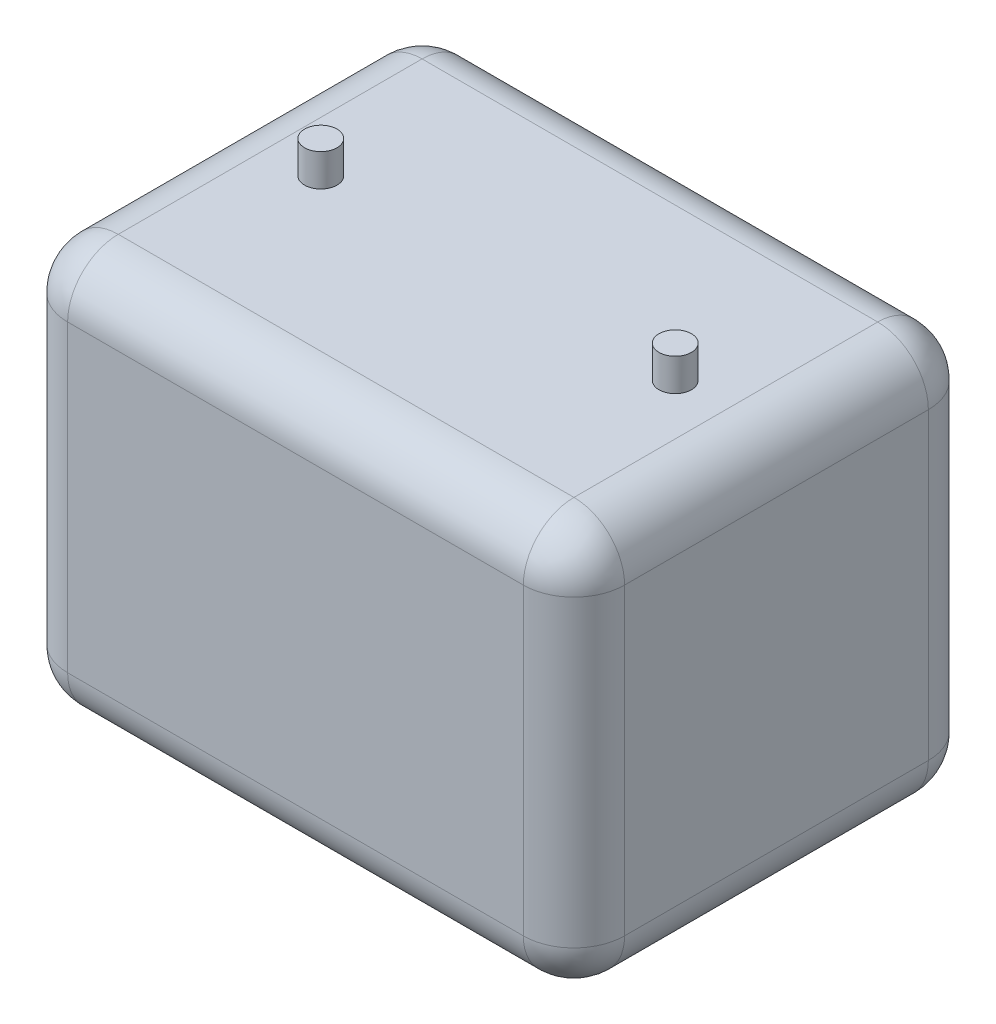
ISO-10303-21;
HEADER;
FILE_DESCRIPTION(('STEP AP214'),'2;1');
FILE_NAME('part.step','',(''),(''),'','','');
FILE_SCHEMA(('AUTOMOTIVE_DESIGN { 1 0 10303 214 1 1 1 1 }'));
ENDSEC;
DATA;
#1=APPLICATION_CONTEXT('core data for automotive mechanical design processes');
#2=APPLICATION_PROTOCOL_DEFINITION('international standard','automotive_design',2000,#1);
#3=PRODUCT_CONTEXT('',#1,'mechanical');
#4=PRODUCT('Part','Part','',(#3));
#5=PRODUCT_RELATED_PRODUCT_CATEGORY('part','',(#4));
#6=PRODUCT_DEFINITION_FORMATION('','',#4);
#7=PRODUCT_DEFINITION_CONTEXT('part definition',#1,'design');
#8=PRODUCT_DEFINITION('design','',#6,#7);
#9=PRODUCT_DEFINITION_SHAPE('','',#8);
#10=(LENGTH_UNIT() NAMED_UNIT(*) SI_UNIT(.MILLI.,.METRE.));
#11=(NAMED_UNIT(*) PLANE_ANGLE_UNIT() SI_UNIT($,.RADIAN.));
#12=(NAMED_UNIT(*) SI_UNIT($,.STERADIAN.) SOLID_ANGLE_UNIT());
#13=UNCERTAINTY_MEASURE_WITH_UNIT(LENGTH_MEASURE(1.E-05),#10,'distance_accuracy_value','');
#14=(GEOMETRIC_REPRESENTATION_CONTEXT(3) GLOBAL_UNCERTAINTY_ASSIGNED_CONTEXT((#13)) GLOBAL_UNIT_ASSIGNED_CONTEXT((#10,
#11,#12)) REPRESENTATION_CONTEXT('',''));
#15=CARTESIAN_POINT('',(0.,0.,0.));
#16=DIRECTION('',(0.,0.,1.));
#17=DIRECTION('',(1.,0.,0.));
#18=AXIS2_PLACEMENT_3D('',#15,#16,#17);
#19=CARTESIAN_POINT('',(27.5,20.,40.));
#20=DIRECTION('',(-1.,0.,0.));
#21=DIRECTION('',(0.,0.,1.));
#22=AXIS2_PLACEMENT_3D('',#19,#20,#21);
#23=PLANE('',#22);
#24=DIRECTION('',(0.,0.,-1.));
#25=VECTOR('',#24,1.);
#26=CARTESIAN_POINT('',(27.5,-15.,40.));
#27=LINE('',#26,#25);
#28=CARTESIAN_POINT('',(27.5,-15.,35.));
#29=VERTEX_POINT('',#28);
#30=CARTESIAN_POINT('',(27.5,-15.,5.));
#31=VERTEX_POINT('',#30);
#32=EDGE_CURVE('E144',#29,#31,#27,.T.);
#33=ORIENTED_EDGE('',*,*,#32,.T.);
#34=DIRECTION('',(0.,1.,0.));
#35=VECTOR('',#34,1.);
#36=CARTESIAN_POINT('',(27.5,20.,5.));
#37=LINE('',#36,#35);
#38=CARTESIAN_POINT('',(27.5,15.,5.));
#39=VERTEX_POINT('',#38);
#40=EDGE_CURVE('E138',#31,#39,#37,.T.);
#41=ORIENTED_EDGE('',*,*,#40,.T.);
#42=DIRECTION('',(0.,0.,-1.));
#43=VECTOR('',#42,1.);
#44=CARTESIAN_POINT('',(27.5,15.,40.));
#45=LINE('',#44,#43);
#46=CARTESIAN_POINT('',(27.5,15.,35.));
#47=VERTEX_POINT('',#46);
#48=EDGE_CURVE('E131',#39,#47,#45,.F.);
#49=ORIENTED_EDGE('',*,*,#48,.T.);
#50=DIRECTION('',(0.,1.,0.));
#51=VECTOR('',#50,1.);
#52=CARTESIAN_POINT('',(27.5,-15.,35.));
#53=LINE('',#52,#51);
#54=EDGE_CURVE('E135',#47,#29,#53,.F.);
#55=ORIENTED_EDGE('',*,*,#54,.T.);
#56=EDGE_LOOP('',(#33,#41,#49,#55));
#57=FACE_BOUND('',#56,.T.);
#58=ADVANCED_FACE('F41',(#57),#23,.F.);
#59=CARTESIAN_POINT('',(-27.5,20.,40.));
#60=DIRECTION('',(0.,-1.,0.));
#61=DIRECTION('',(0.,0.,-1.));
#62=AXIS2_PLACEMENT_3D('',#59,#60,#61);
#63=PLANE('',#62);
#64=CARTESIAN_POINT('',(17.5,20.,20.));
#65=DIRECTION('',(0.,-1.,0.));
#66=DIRECTION('',(0.,0.,-1.));
#67=AXIS2_PLACEMENT_3D('',#64,#65,#66);
#68=CIRCLE('',#67,1.6);
#69=CARTESIAN_POINT('',(17.5,20.,18.4));
#70=VERTEX_POINT('',#69);
#71=EDGE_CURVE('E697',#70,#70,#68,.F.);
#72=ORIENTED_EDGE('',*,*,#71,.F.);
#73=EDGE_LOOP('',(#72));
#74=FACE_BOUND('',#73,.T.);
#75=CARTESIAN_POINT('',(-17.5,20.,20.));
#76=DIRECTION('',(0.,-1.,0.));
#77=DIRECTION('',(0.,0.,-1.));
#78=AXIS2_PLACEMENT_3D('',#75,#76,#77);
#79=CIRCLE('',#78,1.6);
#80=CARTESIAN_POINT('',(-17.5,20.,18.4));
#81=VERTEX_POINT('',#80);
#82=EDGE_CURVE('E700',#81,#81,#79,.F.);
#83=ORIENTED_EDGE('',*,*,#82,.F.);
#84=EDGE_LOOP('',(#83));
#85=FACE_BOUND('',#84,.T.);
#86=DIRECTION('',(0.,0.,-1.));
#87=VECTOR('',#86,1.);
#88=CARTESIAN_POINT('',(22.5,20.,40.));
#89=LINE('',#88,#87);
#90=CARTESIAN_POINT('',(22.5,20.,35.));
#91=VERTEX_POINT('',#90);
#92=CARTESIAN_POINT('',(22.5,20.,5.));
#93=VERTEX_POINT('',#92);
#94=EDGE_CURVE('E171',#91,#93,#89,.T.);
#95=ORIENTED_EDGE('',*,*,#94,.T.);
#96=DIRECTION('',(-1.,0.,0.));
#97=VECTOR('',#96,1.);
#98=CARTESIAN_POINT('',(-27.5,20.,5.));
#99=LINE('',#98,#97);
#100=CARTESIAN_POINT('',(-22.5,20.,5.));
#101=VERTEX_POINT('',#100);
#102=EDGE_CURVE('E11',#93,#101,#99,.T.);
#103=ORIENTED_EDGE('',*,*,#102,.T.);
#104=DIRECTION('',(0.,0.,-1.));
#105=VECTOR('',#104,1.);
#106=CARTESIAN_POINT('',(-22.5,20.,40.));
#107=LINE('',#106,#105);
#108=CARTESIAN_POINT('',(-22.5,20.,35.));
#109=VERTEX_POINT('',#108);
#110=EDGE_CURVE('E145',#101,#109,#107,.F.);
#111=ORIENTED_EDGE('',*,*,#110,.T.);
#112=DIRECTION('',(-1.,0.,0.));
#113=VECTOR('',#112,1.);
#114=CARTESIAN_POINT('',(22.5,20.,35.));
#115=LINE('',#114,#113);
#116=EDGE_CURVE('E208',#109,#91,#115,.F.);
#117=ORIENTED_EDGE('',*,*,#116,.T.);
#118=EDGE_LOOP('',(#95,#103,#111,#117));
#119=FACE_BOUND('',#118,.T.);
#120=ADVANCED_FACE('F366',(#74,#85,#119),#63,.F.);
#121=CARTESIAN_POINT('',(-27.5,20.,40.));
#122=DIRECTION('',(1.,0.,0.));
#123=DIRECTION('',(0.,1.,0.));
#124=AXIS2_PLACEMENT_3D('',#121,#122,#123);
#125=PLANE('',#124);
#126=DIRECTION('',(0.,0.,-1.));
#127=VECTOR('',#126,1.);
#128=CARTESIAN_POINT('',(-27.5,15.,40.));
#129=LINE('',#128,#127);
#130=CARTESIAN_POINT('',(-27.5,15.,35.));
#131=VERTEX_POINT('',#130);
#132=CARTESIAN_POINT('',(-27.5,15.,5.));
#133=VERTEX_POINT('',#132);
#134=EDGE_CURVE('E318',#131,#133,#129,.T.);
#135=ORIENTED_EDGE('',*,*,#134,.T.);
#136=DIRECTION('',(0.,-1.,0.));
#137=VECTOR('',#136,1.);
#138=CARTESIAN_POINT('',(-27.5,20.,5.));
#139=LINE('',#138,#137);
#140=CARTESIAN_POINT('',(-27.5,-15.,5.));
#141=VERTEX_POINT('',#140);
#142=EDGE_CURVE('E262',#133,#141,#139,.T.);
#143=ORIENTED_EDGE('',*,*,#142,.T.);
#144=DIRECTION('',(0.,0.,-1.));
#145=VECTOR('',#144,1.);
#146=CARTESIAN_POINT('',(-27.5,-15.,40.));
#147=LINE('',#146,#145);
#148=CARTESIAN_POINT('',(-27.5,-15.,35.));
#149=VERTEX_POINT('',#148);
#150=EDGE_CURVE('E312',#141,#149,#147,.F.);
#151=ORIENTED_EDGE('',*,*,#150,.T.);
#152=DIRECTION('',(0.,-1.,0.));
#153=VECTOR('',#152,1.);
#154=CARTESIAN_POINT('',(-27.5,15.,35.));
#155=LINE('',#154,#153);
#156=EDGE_CURVE('E201',#149,#131,#155,.F.);
#157=ORIENTED_EDGE('',*,*,#156,.T.);
#158=EDGE_LOOP('',(#135,#143,#151,#157));
#159=FACE_BOUND('',#158,.T.);
#160=ADVANCED_FACE('F371',(#159),#125,.F.);
#161=CARTESIAN_POINT('',(-27.5,-20.,40.));
#162=DIRECTION('',(0.,1.,0.));
#163=DIRECTION('',(0.,0.,1.));
#164=AXIS2_PLACEMENT_3D('',#161,#162,#163);
#165=PLANE('',#164);
#166=CARTESIAN_POINT('',(17.5,-20.,20.));
#167=DIRECTION('',(0.,1.,0.));
#168=DIRECTION('',(0.,0.,1.));
#169=AXIS2_PLACEMENT_3D('',#166,#167,#168);
#170=CIRCLE('',#169,1.6);
#171=CARTESIAN_POINT('',(17.5,-20.,21.6));
#172=VERTEX_POINT('',#171);
#173=EDGE_CURVE('E319',#172,#172,#170,.F.);
#174=ORIENTED_EDGE('',*,*,#173,.F.);
#175=EDGE_LOOP('',(#174));
#176=FACE_BOUND('',#175,.T.);
#177=CARTESIAN_POINT('',(-17.5,-20.,20.));
#178=DIRECTION('',(0.,1.,0.));
#179=DIRECTION('',(0.,0.,1.));
#180=AXIS2_PLACEMENT_3D('',#177,#178,#179);
#181=CIRCLE('',#180,1.6);
#182=CARTESIAN_POINT('',(-17.5,-20.,21.6));
#183=VERTEX_POINT('',#182);
#184=EDGE_CURVE('E325',#183,#183,#181,.F.);
#185=ORIENTED_EDGE('',*,*,#184,.F.);
#186=EDGE_LOOP('',(#185));
#187=FACE_BOUND('',#186,.T.);
#188=DIRECTION('',(0.,0.,-1.));
#189=VECTOR('',#188,1.);
#190=CARTESIAN_POINT('',(-22.5,-20.,40.));
#191=LINE('',#190,#189);
#192=CARTESIAN_POINT('',(-22.5,-20.,35.));
#193=VERTEX_POINT('',#192);
#194=CARTESIAN_POINT('',(-22.5,-20.,5.));
#195=VERTEX_POINT('',#194);
#196=EDGE_CURVE('E310',#193,#195,#191,.T.);
#197=ORIENTED_EDGE('',*,*,#196,.T.);
#198=DIRECTION('',(1.,0.,0.));
#199=VECTOR('',#198,1.);
#200=CARTESIAN_POINT('',(-27.5,-20.,5.));
#201=LINE('',#200,#199);
#202=CARTESIAN_POINT('',(22.5,-20.,5.));
#203=VERTEX_POINT('',#202);
#204=EDGE_CURVE('E256',#195,#203,#201,.T.);
#205=ORIENTED_EDGE('',*,*,#204,.T.);
#206=DIRECTION('',(0.,0.,-1.));
#207=VECTOR('',#206,1.);
#208=CARTESIAN_POINT('',(22.5,-20.,40.));
#209=LINE('',#208,#207);
#210=CARTESIAN_POINT('',(22.5,-20.,35.));
#211=VERTEX_POINT('',#210);
#212=EDGE_CURVE('E179',#203,#211,#209,.F.);
#213=ORIENTED_EDGE('',*,*,#212,.T.);
#214=DIRECTION('',(1.,0.,0.));
#215=VECTOR('',#214,1.);
#216=CARTESIAN_POINT('',(-22.5,-20.,35.));
#217=LINE('',#216,#215);
#218=EDGE_CURVE('E194',#211,#193,#217,.F.);
#219=ORIENTED_EDGE('',*,*,#218,.T.);
#220=EDGE_LOOP('',(#197,#205,#213,#219));
#221=FACE_BOUND('',#220,.T.);
#222=ADVANCED_FACE('F314',(#176,#187,#221),#165,.F.);
#223=CARTESIAN_POINT('',(0.,0.,40.));
#224=DIRECTION('',(0.,0.,1.));
#225=DIRECTION('',(1.,0.,0.));
#226=AXIS2_PLACEMENT_3D('',#223,#224,#225);
#227=PLANE('',#226);
#228=DIRECTION('',(1.,0.,0.));
#229=VECTOR('',#228,1.);
#230=CARTESIAN_POINT('',(22.5,-15.,40.));
#231=LINE('',#230,#229);
#232=CARTESIAN_POINT('',(-22.5,-15.,40.));
#233=VERTEX_POINT('',#232);
#234=CARTESIAN_POINT('',(22.5,-15.,40.));
#235=VERTEX_POINT('',#234);
#236=EDGE_CURVE('E185',#233,#235,#231,.T.);
#237=ORIENTED_EDGE('',*,*,#236,.T.);
#238=DIRECTION('',(0.,1.,0.));
#239=VECTOR('',#238,1.);
#240=CARTESIAN_POINT('',(22.5,15.,40.));
#241=LINE('',#240,#239);
#242=CARTESIAN_POINT('',(22.5,15.,40.));
#243=VERTEX_POINT('',#242);
#244=EDGE_CURVE('E167',#235,#243,#241,.T.);
#245=ORIENTED_EDGE('',*,*,#244,.T.);
#246=DIRECTION('',(-1.,0.,0.));
#247=VECTOR('',#246,1.);
#248=CARTESIAN_POINT('',(-22.5,15.,40.));
#249=LINE('',#248,#247);
#250=CARTESIAN_POINT('',(-22.5,15.,40.));
#251=VERTEX_POINT('',#250);
#252=EDGE_CURVE('E173',#243,#251,#249,.T.);
#253=ORIENTED_EDGE('',*,*,#252,.T.);
#254=DIRECTION('',(0.,-1.,0.));
#255=VECTOR('',#254,1.);
#256=CARTESIAN_POINT('',(-22.5,-15.,40.));
#257=LINE('',#256,#255);
#258=EDGE_CURVE('E177',#251,#233,#257,.T.);
#259=ORIENTED_EDGE('',*,*,#258,.T.);
#260=EDGE_LOOP('',(#237,#245,#253,#259));
#261=FACE_BOUND('',#260,.T.);
#262=ADVANCED_FACE('F347',(#261),#227,.T.);
#263=CARTESIAN_POINT('',(0.,0.,0.));
#264=DIRECTION('',(0.,0.,1.));
#265=DIRECTION('',(1.,0.,0.));
#266=AXIS2_PLACEMENT_3D('',#263,#264,#265);
#267=PLANE('',#266);
#268=DIRECTION('',(-1.,0.,0.));
#269=VECTOR('',#268,1.);
#270=CARTESIAN_POINT('',(0.,15.,0.));
#271=LINE('',#270,#269);
#272=CARTESIAN_POINT('',(-22.5,15.,0.));
#273=VERTEX_POINT('',#272);
#274=CARTESIAN_POINT('',(22.5,15.,0.));
#275=VERTEX_POINT('',#274);
#276=EDGE_CURVE('E240',#273,#275,#271,.F.);
#277=ORIENTED_EDGE('',*,*,#276,.T.);
#278=DIRECTION('',(0.,1.,0.));
#279=VECTOR('',#278,1.);
#280=CARTESIAN_POINT('',(22.5,0.,0.));
#281=LINE('',#280,#279);
#282=CARTESIAN_POINT('',(22.5,-15.,0.));
#283=VERTEX_POINT('',#282);
#284=EDGE_CURVE('E249',#275,#283,#281,.F.);
#285=ORIENTED_EDGE('',*,*,#284,.T.);
#286=DIRECTION('',(1.,0.,0.));
#287=VECTOR('',#286,1.);
#288=CARTESIAN_POINT('',(0.,-15.,0.));
#289=LINE('',#288,#287);
#290=CARTESIAN_POINT('',(-22.5,-15.,0.));
#291=VERTEX_POINT('',#290);
#292=EDGE_CURVE('E246',#283,#291,#289,.F.);
#293=ORIENTED_EDGE('',*,*,#292,.T.);
#294=DIRECTION('',(0.,-1.,0.));
#295=VECTOR('',#294,1.);
#296=CARTESIAN_POINT('',(-22.5,0.,0.));
#297=LINE('',#296,#295);
#298=EDGE_CURVE('E243',#291,#273,#297,.F.);
#299=ORIENTED_EDGE('',*,*,#298,.T.);
#300=EDGE_LOOP('',(#277,#285,#293,#299));
#301=FACE_BOUND('',#300,.T.);
#302=ADVANCED_FACE('F624',(#301),#267,.F.);
#303=CARTESIAN_POINT('',(-17.5,23.2,20.));
#304=DIRECTION('',(0.,-1.,0.));
#305=DIRECTION('',(0.,0.,-1.));
#306=AXIS2_PLACEMENT_3D('',#303,#304,#305);
#307=CYLINDRICAL_SURFACE('',#306,1.6);
#308=CARTESIAN_POINT('',(-17.5,23.2,20.));
#309=DIRECTION('',(0.,1.,0.));
#310=DIRECTION('',(0.,0.,1.));
#311=AXIS2_PLACEMENT_3D('',#308,#309,#310);
#312=CIRCLE('',#311,1.6);
#313=CARTESIAN_POINT('',(-17.5,23.2,21.6));
#314=VERTEX_POINT('',#313);
#315=EDGE_CURVE('E706',#314,#314,#312,.T.);
#316=ORIENTED_EDGE('',*,*,#315,.F.);
#317=EDGE_LOOP('',(#316));
#318=FACE_BOUND('',#317,.T.);
#319=ORIENTED_EDGE('',*,*,#82,.T.);
#320=EDGE_LOOP('',(#319));
#321=FACE_BOUND('',#320,.T.);
#322=ADVANCED_FACE('F615',(#318,#321),#307,.T.);
#323=CARTESIAN_POINT('',(-17.5,23.2,20.));
#324=DIRECTION('',(0.,1.,0.));
#325=DIRECTION('',(0.,0.,1.));
#326=AXIS2_PLACEMENT_3D('',#323,#324,#325);
#327=PLANE('',#326);
#328=ORIENTED_EDGE('',*,*,#315,.T.);
#329=EDGE_LOOP('',(#328));
#330=FACE_BOUND('',#329,.T.);
#331=ADVANCED_FACE('F606',(#330),#327,.T.);
#332=CARTESIAN_POINT('',(17.5,23.2,20.));
#333=DIRECTION('',(0.,-1.,0.));
#334=DIRECTION('',(0.,0.,-1.));
#335=AXIS2_PLACEMENT_3D('',#332,#333,#334);
#336=CYLINDRICAL_SURFACE('',#335,1.6);
#337=CARTESIAN_POINT('',(17.5,23.2,20.));
#338=DIRECTION('',(0.,1.,0.));
#339=DIRECTION('',(0.,0.,1.));
#340=AXIS2_PLACEMENT_3D('',#337,#338,#339);
#341=CIRCLE('',#340,1.6);
#342=CARTESIAN_POINT('',(17.5,23.2,21.6));
#343=VERTEX_POINT('',#342);
#344=EDGE_CURVE('E710',#343,#343,#341,.T.);
#345=ORIENTED_EDGE('',*,*,#344,.F.);
#346=EDGE_LOOP('',(#345));
#347=FACE_BOUND('',#346,.T.);
#348=ORIENTED_EDGE('',*,*,#71,.T.);
#349=EDGE_LOOP('',(#348));
#350=FACE_BOUND('',#349,.T.);
#351=ADVANCED_FACE('F597',(#347,#350),#336,.T.);
#352=CARTESIAN_POINT('',(17.5,23.2,20.));
#353=DIRECTION('',(0.,1.,0.));
#354=DIRECTION('',(0.,0.,1.));
#355=AXIS2_PLACEMENT_3D('',#352,#353,#354);
#356=PLANE('',#355);
#357=ORIENTED_EDGE('',*,*,#344,.T.);
#358=EDGE_LOOP('',(#357));
#359=FACE_BOUND('',#358,.T.);
#360=ADVANCED_FACE('F588',(#359),#356,.T.);
#361=CARTESIAN_POINT('',(-17.5,-23.2,20.));
#362=DIRECTION('',(0.,1.,0.));
#363=DIRECTION('',(0.,0.,1.));
#364=AXIS2_PLACEMENT_3D('',#361,#362,#363);
#365=CYLINDRICAL_SURFACE('',#364,1.6);
#366=CARTESIAN_POINT('',(-17.5,-23.2,20.));
#367=DIRECTION('',(0.,-1.,0.));
#368=DIRECTION('',(0.,0.,-1.));
#369=AXIS2_PLACEMENT_3D('',#366,#367,#368);
#370=CIRCLE('',#369,1.6);
#371=CARTESIAN_POINT('',(-17.5,-23.2,18.4));
#372=VERTEX_POINT('',#371);
#373=EDGE_CURVE('E714',#372,#372,#370,.T.);
#374=ORIENTED_EDGE('',*,*,#373,.F.);
#375=EDGE_LOOP('',(#374));
#376=FACE_BOUND('',#375,.T.);
#377=ORIENTED_EDGE('',*,*,#184,.T.);
#378=EDGE_LOOP('',(#377));
#379=FACE_BOUND('',#378,.T.);
#380=ADVANCED_FACE('F579',(#376,#379),#365,.T.);
#381=CARTESIAN_POINT('',(-17.5,-23.2,20.));
#382=DIRECTION('',(0.,-1.,0.));
#383=DIRECTION('',(0.,0.,-1.));
#384=AXIS2_PLACEMENT_3D('',#381,#382,#383);
#385=PLANE('',#384);
#386=ORIENTED_EDGE('',*,*,#373,.T.);
#387=EDGE_LOOP('',(#386));
#388=FACE_BOUND('',#387,.T.);
#389=ADVANCED_FACE('F570',(#388),#385,.T.);
#390=CARTESIAN_POINT('',(17.5,-23.2,20.));
#391=DIRECTION('',(0.,1.,0.));
#392=DIRECTION('',(0.,0.,1.));
#393=AXIS2_PLACEMENT_3D('',#390,#391,#392);
#394=CYLINDRICAL_SURFACE('',#393,1.6);
#395=CARTESIAN_POINT('',(17.5,-23.2,20.));
#396=DIRECTION('',(0.,-1.,0.));
#397=DIRECTION('',(0.,0.,-1.));
#398=AXIS2_PLACEMENT_3D('',#395,#396,#397);
#399=CIRCLE('',#398,1.6);
#400=CARTESIAN_POINT('',(17.5,-23.2,18.4));
#401=VERTEX_POINT('',#400);
#402=EDGE_CURVE('E235',#401,#401,#399,.T.);
#403=ORIENTED_EDGE('',*,*,#402,.F.);
#404=EDGE_LOOP('',(#403));
#405=FACE_BOUND('',#404,.T.);
#406=ORIENTED_EDGE('',*,*,#173,.T.);
#407=EDGE_LOOP('',(#406));
#408=FACE_BOUND('',#407,.T.);
#409=ADVANCED_FACE('F561',(#405,#408),#394,.T.);
#410=CARTESIAN_POINT('',(17.5,-23.2,20.));
#411=DIRECTION('',(0.,-1.,0.));
#412=DIRECTION('',(0.,0.,-1.));
#413=AXIS2_PLACEMENT_3D('',#410,#411,#412);
#414=PLANE('',#413);
#415=ORIENTED_EDGE('',*,*,#402,.T.);
#416=EDGE_LOOP('',(#415));
#417=FACE_BOUND('',#416,.T.);
#418=ADVANCED_FACE('F379',(#417),#414,.T.);
#419=CARTESIAN_POINT('',(-22.5,-15.,40.));
#420=DIRECTION('',(0.,0.,-1.));
#421=DIRECTION('',(-1.,0.,0.));
#422=AXIS2_PLACEMENT_3D('',#419,#420,#421);
#423=CYLINDRICAL_SURFACE('',#422,5.);
#424=ORIENTED_EDGE('',*,*,#150,.F.);
#425=CARTESIAN_POINT('',(-22.5,-15.,5.));
#426=DIRECTION('',(0.,0.,-1.));
#427=DIRECTION('',(-1.,0.,0.));
#428=AXIS2_PLACEMENT_3D('',#425,#426,#427);
#429=CIRCLE('',#428,5.);
#430=EDGE_CURVE('E259',#141,#195,#429,.F.);
#431=ORIENTED_EDGE('',*,*,#430,.T.);
#432=ORIENTED_EDGE('',*,*,#196,.F.);
#433=CARTESIAN_POINT('',(-22.5,-15.,35.));
#434=DIRECTION('',(0.,0.,-1.));
#435=DIRECTION('',(-1.,0.,0.));
#436=AXIS2_PLACEMENT_3D('',#433,#434,#435);
#437=CIRCLE('',#436,5.);
#438=EDGE_CURVE('E197',#193,#149,#437,.T.);
#439=ORIENTED_EDGE('',*,*,#438,.T.);
#440=EDGE_LOOP('',(#424,#431,#432,#439));
#441=FACE_BOUND('',#440,.T.);
#442=ADVANCED_FACE('F309',(#441),#423,.T.);
#443=CARTESIAN_POINT('',(-22.5,15.,40.));
#444=DIRECTION('',(0.,0.,-1.));
#445=DIRECTION('',(-1.,0.,0.));
#446=AXIS2_PLACEMENT_3D('',#443,#444,#445);
#447=CYLINDRICAL_SURFACE('',#446,5.);
#448=ORIENTED_EDGE('',*,*,#110,.F.);
#449=CARTESIAN_POINT('',(-22.5,15.,5.));
#450=DIRECTION('',(0.,0.,-1.));
#451=DIRECTION('',(-1.,0.,0.));
#452=AXIS2_PLACEMENT_3D('',#449,#450,#451);
#453=CIRCLE('',#452,5.);
#454=EDGE_CURVE('E51',#101,#133,#453,.F.);
#455=ORIENTED_EDGE('',*,*,#454,.T.);
#456=ORIENTED_EDGE('',*,*,#134,.F.);
#457=CARTESIAN_POINT('',(-22.5,15.,35.));
#458=DIRECTION('',(0.,0.,-1.));
#459=DIRECTION('',(-1.,0.,0.));
#460=AXIS2_PLACEMENT_3D('',#457,#458,#459);
#461=CIRCLE('',#460,5.);
#462=EDGE_CURVE('E204',#131,#109,#461,.T.);
#463=ORIENTED_EDGE('',*,*,#462,.T.);
#464=EDGE_LOOP('',(#448,#455,#456,#463));
#465=FACE_BOUND('',#464,.T.);
#466=ADVANCED_FACE('F378',(#465),#447,.T.);
#467=CARTESIAN_POINT('',(22.5,-15.,40.));
#468=DIRECTION('',(0.,0.,-1.));
#469=DIRECTION('',(-1.,0.,0.));
#470=AXIS2_PLACEMENT_3D('',#467,#468,#469);
#471=CYLINDRICAL_SURFACE('',#470,5.);
#472=ORIENTED_EDGE('',*,*,#212,.F.);
#473=CARTESIAN_POINT('',(22.5,-15.,5.));
#474=DIRECTION('',(0.,0.,-1.));
#475=DIRECTION('',(-1.,0.,0.));
#476=AXIS2_PLACEMENT_3D('',#473,#474,#475);
#477=CIRCLE('',#476,5.);
#478=EDGE_CURVE('E253',#203,#31,#477,.F.);
#479=ORIENTED_EDGE('',*,*,#478,.T.);
#480=ORIENTED_EDGE('',*,*,#32,.F.);
#481=CARTESIAN_POINT('',(22.5,-15.,35.));
#482=DIRECTION('',(0.,0.,-1.));
#483=DIRECTION('',(-1.,0.,0.));
#484=AXIS2_PLACEMENT_3D('',#481,#482,#483);
#485=CIRCLE('',#484,5.);
#486=EDGE_CURVE('E166',#29,#211,#485,.T.);
#487=ORIENTED_EDGE('',*,*,#486,.T.);
#488=EDGE_LOOP('',(#472,#479,#480,#487));
#489=FACE_BOUND('',#488,.T.);
#490=ADVANCED_FACE('F338',(#489),#471,.T.);
#491=CARTESIAN_POINT('',(22.5,15.,40.));
#492=DIRECTION('',(0.,0.,-1.));
#493=DIRECTION('',(-1.,0.,0.));
#494=AXIS2_PLACEMENT_3D('',#491,#492,#493);
#495=CYLINDRICAL_SURFACE('',#494,5.);
#496=ORIENTED_EDGE('',*,*,#48,.F.);
#497=CARTESIAN_POINT('',(22.5,15.,5.));
#498=DIRECTION('',(0.,0.,-1.));
#499=DIRECTION('',(-1.,0.,0.));
#500=AXIS2_PLACEMENT_3D('',#497,#498,#499);
#501=CIRCLE('',#500,5.);
#502=EDGE_CURVE('E211',#39,#93,#501,.F.);
#503=ORIENTED_EDGE('',*,*,#502,.T.);
#504=ORIENTED_EDGE('',*,*,#94,.F.);
#505=CARTESIAN_POINT('',(22.5,15.,35.));
#506=DIRECTION('',(0.,0.,-1.));
#507=DIRECTION('',(-1.,0.,0.));
#508=AXIS2_PLACEMENT_3D('',#505,#506,#507);
#509=CIRCLE('',#508,5.);
#510=EDGE_CURVE('E152',#91,#47,#509,.T.);
#511=ORIENTED_EDGE('',*,*,#510,.T.);
#512=EDGE_LOOP('',(#496,#503,#504,#511));
#513=FACE_BOUND('',#512,.T.);
#514=ADVANCED_FACE('F170',(#513),#495,.T.);
#515=CARTESIAN_POINT('',(-22.5,-15.,35.));
#516=DIRECTION('',(0.,0.,1.));
#517=DIRECTION('',(1.,0.,0.));
#518=AXIS2_PLACEMENT_3D('',#515,#516,#517);
#519=SPHERICAL_SURFACE('',#518,5.);
#520=CARTESIAN_POINT('',(-22.5,-15.,35.));
#521=DIRECTION('',(0.,1.,0.));
#522=DIRECTION('',(-1.,0.,0.));
#523=AXIS2_PLACEMENT_3D('',#520,#521,#522);
#524=CIRCLE('',#523,5.);
#525=EDGE_CURVE('E227',#149,#233,#524,.T.);
#526=ORIENTED_EDGE('',*,*,#525,.F.);
#527=ORIENTED_EDGE('',*,*,#438,.F.);
#528=CARTESIAN_POINT('',(-22.5,-15.,35.));
#529=DIRECTION('',(1.,0.,0.));
#530=DIRECTION('',(0.,0.,-1.));
#531=AXIS2_PLACEMENT_3D('',#528,#529,#530);
#532=CIRCLE('',#531,5.);
#533=EDGE_CURVE('E231',#233,#193,#532,.T.);
#534=ORIENTED_EDGE('',*,*,#533,.F.);
#535=EDGE_LOOP('',(#526,#527,#534));
#536=FACE_BOUND('',#535,.T.);
#537=ADVANCED_FACE('F355',(#536),#519,.T.);
#538=CARTESIAN_POINT('',(0.,-15.,35.));
#539=DIRECTION('',(-1.,0.,0.));
#540=DIRECTION('',(0.,0.,1.));
#541=AXIS2_PLACEMENT_3D('',#538,#539,#540);
#542=CYLINDRICAL_SURFACE('',#541,5.);
#543=ORIENTED_EDGE('',*,*,#533,.T.);
#544=ORIENTED_EDGE('',*,*,#218,.F.);
#545=CARTESIAN_POINT('',(22.5,-15.,35.));
#546=DIRECTION('',(1.,0.,0.));
#547=DIRECTION('',(0.,1.,0.));
#548=AXIS2_PLACEMENT_3D('',#545,#546,#547);
#549=CIRCLE('',#548,5.);
#550=EDGE_CURVE('E223',#235,#211,#549,.T.);
#551=ORIENTED_EDGE('',*,*,#550,.F.);
#552=ORIENTED_EDGE('',*,*,#236,.F.);
#553=EDGE_LOOP('',(#543,#544,#551,#552));
#554=FACE_BOUND('',#553,.T.);
#555=ADVANCED_FACE('F342',(#554),#542,.T.);
#556=CARTESIAN_POINT('',(-22.5,0.,35.));
#557=DIRECTION('',(0.,1.,0.));
#558=DIRECTION('',(-1.,0.,0.));
#559=AXIS2_PLACEMENT_3D('',#556,#557,#558);
#560=CYLINDRICAL_SURFACE('',#559,5.);
#561=ORIENTED_EDGE('',*,*,#525,.T.);
#562=ORIENTED_EDGE('',*,*,#258,.F.);
#563=CARTESIAN_POINT('',(-22.5,15.,35.));
#564=DIRECTION('',(0.,1.,0.));
#565=DIRECTION('',(0.,0.,1.));
#566=AXIS2_PLACEMENT_3D('',#563,#564,#565);
#567=CIRCLE('',#566,5.);
#568=EDGE_CURVE('E219',#131,#251,#567,.T.);
#569=ORIENTED_EDGE('',*,*,#568,.F.);
#570=ORIENTED_EDGE('',*,*,#156,.F.);
#571=EDGE_LOOP('',(#561,#562,#569,#570));
#572=FACE_BOUND('',#571,.T.);
#573=ADVANCED_FACE('F353',(#572),#560,.T.);
#574=CARTESIAN_POINT('',(22.5,-15.,35.));
#575=DIRECTION('',(0.,0.,1.));
#576=DIRECTION('',(1.,0.,0.));
#577=AXIS2_PLACEMENT_3D('',#574,#575,#576);
#578=SPHERICAL_SURFACE('',#577,5.);
#579=ORIENTED_EDGE('',*,*,#550,.T.);
#580=ORIENTED_EDGE('',*,*,#486,.F.);
#581=CARTESIAN_POINT('',(22.5,-15.,35.));
#582=DIRECTION('',(0.,1.,0.));
#583=DIRECTION('',(0.,0.,1.));
#584=AXIS2_PLACEMENT_3D('',#581,#582,#583);
#585=CIRCLE('',#584,5.);
#586=EDGE_CURVE('E164',#235,#29,#585,.T.);
#587=ORIENTED_EDGE('',*,*,#586,.F.);
#588=EDGE_LOOP('',(#579,#580,#587));
#589=FACE_BOUND('',#588,.T.);
#590=ADVANCED_FACE('F345',(#589),#578,.T.);
#591=CARTESIAN_POINT('',(-22.5,15.,35.));
#592=DIRECTION('',(0.,0.,1.));
#593=DIRECTION('',(1.,0.,0.));
#594=AXIS2_PLACEMENT_3D('',#591,#592,#593);
#595=SPHERICAL_SURFACE('',#594,5.);
#596=ORIENTED_EDGE('',*,*,#462,.F.);
#597=ORIENTED_EDGE('',*,*,#568,.T.);
#598=CARTESIAN_POINT('',(-22.5,15.,35.));
#599=DIRECTION('',(1.,0.,0.));
#600=DIRECTION('',(0.,0.,-1.));
#601=AXIS2_PLACEMENT_3D('',#598,#599,#600);
#602=CIRCLE('',#601,5.);
#603=EDGE_CURVE('E159',#109,#251,#602,.T.);
#604=ORIENTED_EDGE('',*,*,#603,.F.);
#605=EDGE_LOOP('',(#596,#597,#604));
#606=FACE_BOUND('',#605,.T.);
#607=ADVANCED_FACE('F392',(#606),#595,.T.);
#608=CARTESIAN_POINT('',(22.5,0.,35.));
#609=DIRECTION('',(0.,-1.,0.));
#610=DIRECTION('',(0.,0.,-1.));
#611=AXIS2_PLACEMENT_3D('',#608,#609,#610);
#612=CYLINDRICAL_SURFACE('',#611,5.);
#613=ORIENTED_EDGE('',*,*,#586,.T.);
#614=ORIENTED_EDGE('',*,*,#54,.F.);
#615=CARTESIAN_POINT('',(22.5,15.,35.));
#616=DIRECTION('',(0.,1.,0.));
#617=DIRECTION('',(0.,0.,1.));
#618=AXIS2_PLACEMENT_3D('',#615,#616,#617);
#619=CIRCLE('',#618,5.);
#620=EDGE_CURVE('E150',#243,#47,#619,.T.);
#621=ORIENTED_EDGE('',*,*,#620,.F.);
#622=ORIENTED_EDGE('',*,*,#244,.F.);
#623=EDGE_LOOP('',(#613,#614,#621,#622));
#624=FACE_BOUND('',#623,.T.);
#625=ADVANCED_FACE('F162',(#624),#612,.T.);
#626=CARTESIAN_POINT('',(0.,15.,35.));
#627=DIRECTION('',(1.,0.,0.));
#628=DIRECTION('',(0.,0.,-1.));
#629=AXIS2_PLACEMENT_3D('',#626,#627,#628);
#630=CYLINDRICAL_SURFACE('',#629,5.);
#631=ORIENTED_EDGE('',*,*,#603,.T.);
#632=ORIENTED_EDGE('',*,*,#252,.F.);
#633=CARTESIAN_POINT('',(22.5,15.,35.));
#634=DIRECTION('',(1.,0.,0.));
#635=DIRECTION('',(0.,0.,-1.));
#636=AXIS2_PLACEMENT_3D('',#633,#634,#635);
#637=CIRCLE('',#636,5.);
#638=EDGE_CURVE('E154',#91,#243,#637,.T.);
#639=ORIENTED_EDGE('',*,*,#638,.F.);
#640=ORIENTED_EDGE('',*,*,#116,.F.);
#641=EDGE_LOOP('',(#631,#632,#639,#640));
#642=FACE_BOUND('',#641,.T.);
#643=ADVANCED_FACE('F386',(#642),#630,.T.);
#644=CARTESIAN_POINT('',(22.5,15.,35.));
#645=DIRECTION('',(0.,0.,1.));
#646=DIRECTION('',(1.,0.,0.));
#647=AXIS2_PLACEMENT_3D('',#644,#645,#646);
#648=SPHERICAL_SURFACE('',#647,5.);
#649=ORIENTED_EDGE('',*,*,#620,.T.);
#650=ORIENTED_EDGE('',*,*,#510,.F.);
#651=ORIENTED_EDGE('',*,*,#638,.T.);
#652=EDGE_LOOP('',(#649,#650,#651));
#653=FACE_BOUND('',#652,.T.);
#654=ADVANCED_FACE('F151',(#653),#648,.T.);
#655=CARTESIAN_POINT('',(-22.5,-15.,5.));
#656=DIRECTION('',(0.,0.,1.));
#657=DIRECTION('',(1.,0.,0.));
#658=AXIS2_PLACEMENT_3D('',#655,#656,#657);
#659=SPHERICAL_SURFACE('',#658,5.);
#660=CARTESIAN_POINT('',(-22.5,-15.,5.));
#661=DIRECTION('',(1.,0.,0.));
#662=DIRECTION('',(0.,0.,-1.));
#663=AXIS2_PLACEMENT_3D('',#660,#661,#662);
#664=CIRCLE('',#663,5.);
#665=EDGE_CURVE('E288',#195,#291,#664,.T.);
#666=ORIENTED_EDGE('',*,*,#665,.F.);
#667=ORIENTED_EDGE('',*,*,#430,.F.);
#668=CARTESIAN_POINT('',(-22.5,-15.,5.));
#669=DIRECTION('',(0.,1.,0.));
#670=DIRECTION('',(-1.,0.,0.));
#671=AXIS2_PLACEMENT_3D('',#668,#669,#670);
#672=CIRCLE('',#671,5.);
#673=EDGE_CURVE('E45',#291,#141,#672,.T.);
#674=ORIENTED_EDGE('',*,*,#673,.F.);
#675=EDGE_LOOP('',(#666,#667,#674));
#676=FACE_BOUND('',#675,.T.);
#677=ADVANCED_FACE('F43',(#676),#659,.T.);
#678=CARTESIAN_POINT('',(-22.5,20.,5.));
#679=DIRECTION('',(0.,-1.,0.));
#680=DIRECTION('',(1.,0.,0.));
#681=AXIS2_PLACEMENT_3D('',#678,#679,#680);
#682=CYLINDRICAL_SURFACE('',#681,5.);
#683=ORIENTED_EDGE('',*,*,#673,.T.);
#684=ORIENTED_EDGE('',*,*,#142,.F.);
#685=CARTESIAN_POINT('',(-22.5,15.,5.));
#686=DIRECTION('',(0.,1.,0.));
#687=DIRECTION('',(0.,0.,1.));
#688=AXIS2_PLACEMENT_3D('',#685,#686,#687);
#689=CIRCLE('',#688,5.);
#690=EDGE_CURVE('E285',#273,#133,#689,.T.);
#691=ORIENTED_EDGE('',*,*,#690,.F.);
#692=ORIENTED_EDGE('',*,*,#298,.F.);
#693=EDGE_LOOP('',(#683,#684,#691,#692));
#694=FACE_BOUND('',#693,.T.);
#695=ADVANCED_FACE('F301',(#694),#682,.T.);
#696=CARTESIAN_POINT('',(-27.5,-15.,5.));
#697=DIRECTION('',(1.,0.,0.));
#698=DIRECTION('',(0.,0.,-1.));
#699=AXIS2_PLACEMENT_3D('',#696,#697,#698);
#700=CYLINDRICAL_SURFACE('',#699,5.);
#701=ORIENTED_EDGE('',*,*,#665,.T.);
#702=ORIENTED_EDGE('',*,*,#292,.F.);
#703=CARTESIAN_POINT('',(22.5,-15.,5.));
#704=DIRECTION('',(1.,0.,0.));
#705=DIRECTION('',(0.,0.,-1.));
#706=AXIS2_PLACEMENT_3D('',#703,#704,#705);
#707=CIRCLE('',#706,5.);
#708=EDGE_CURVE('E281',#203,#283,#707,.T.);
#709=ORIENTED_EDGE('',*,*,#708,.F.);
#710=ORIENTED_EDGE('',*,*,#204,.F.);
#711=EDGE_LOOP('',(#701,#702,#709,#710));
#712=FACE_BOUND('',#711,.T.);
#713=ADVANCED_FACE('F435',(#712),#700,.T.);
#714=CARTESIAN_POINT('',(-22.5,15.,5.));
#715=DIRECTION('',(0.,0.,1.));
#716=DIRECTION('',(1.,0.,0.));
#717=AXIS2_PLACEMENT_3D('',#714,#715,#716);
#718=SPHERICAL_SURFACE('',#717,5.);
#719=ORIENTED_EDGE('',*,*,#690,.T.);
#720=ORIENTED_EDGE('',*,*,#454,.F.);
#721=CARTESIAN_POINT('',(-22.5,15.,5.));
#722=DIRECTION('',(1.,0.,0.));
#723=DIRECTION('',(0.,0.,-1.));
#724=AXIS2_PLACEMENT_3D('',#721,#722,#723);
#725=CIRCLE('',#724,5.);
#726=EDGE_CURVE('E277',#273,#101,#725,.T.);
#727=ORIENTED_EDGE('',*,*,#726,.F.);
#728=EDGE_LOOP('',(#719,#720,#727));
#729=FACE_BOUND('',#728,.T.);
#730=ADVANCED_FACE('F441',(#729),#718,.T.);
#731=CARTESIAN_POINT('',(22.5,-15.,5.));
#732=DIRECTION('',(0.,0.,1.));
#733=DIRECTION('',(1.,0.,0.));
#734=AXIS2_PLACEMENT_3D('',#731,#732,#733);
#735=SPHERICAL_SURFACE('',#734,5.);
#736=ORIENTED_EDGE('',*,*,#478,.F.);
#737=ORIENTED_EDGE('',*,*,#708,.T.);
#738=CARTESIAN_POINT('',(22.5,-15.,5.));
#739=DIRECTION('',(0.,1.,0.));
#740=DIRECTION('',(0.,0.,1.));
#741=AXIS2_PLACEMENT_3D('',#738,#739,#740);
#742=CIRCLE('',#741,5.);
#743=EDGE_CURVE('E274',#31,#283,#742,.T.);
#744=ORIENTED_EDGE('',*,*,#743,.F.);
#745=EDGE_LOOP('',(#736,#737,#744));
#746=FACE_BOUND('',#745,.T.);
#747=ADVANCED_FACE('F448',(#746),#735,.T.);
#748=CARTESIAN_POINT('',(-27.5,15.,5.));
#749=DIRECTION('',(-1.,0.,0.));
#750=DIRECTION('',(0.,0.,1.));
#751=AXIS2_PLACEMENT_3D('',#748,#749,#750);
#752=CYLINDRICAL_SURFACE('',#751,5.);
#753=ORIENTED_EDGE('',*,*,#726,.T.);
#754=ORIENTED_EDGE('',*,*,#102,.F.);
#755=CARTESIAN_POINT('',(22.5,15.,5.));
#756=DIRECTION('',(1.,0.,0.));
#757=DIRECTION('',(0.,0.,-1.));
#758=AXIS2_PLACEMENT_3D('',#755,#756,#757);
#759=CIRCLE('',#758,5.);
#760=EDGE_CURVE('E271',#275,#93,#759,.T.);
#761=ORIENTED_EDGE('',*,*,#760,.F.);
#762=ORIENTED_EDGE('',*,*,#276,.F.);
#763=EDGE_LOOP('',(#753,#754,#761,#762));
#764=FACE_BOUND('',#763,.T.);
#765=ADVANCED_FACE('F456',(#764),#752,.T.);
#766=CARTESIAN_POINT('',(22.5,20.,5.));
#767=DIRECTION('',(0.,1.,0.));
#768=DIRECTION('',(0.,0.,1.));
#769=AXIS2_PLACEMENT_3D('',#766,#767,#768);
#770=CYLINDRICAL_SURFACE('',#769,5.);
#771=ORIENTED_EDGE('',*,*,#743,.T.);
#772=ORIENTED_EDGE('',*,*,#284,.F.);
#773=CARTESIAN_POINT('',(22.5,15.,5.));
#774=DIRECTION('',(0.,1.,0.));
#775=DIRECTION('',(0.,0.,1.));
#776=AXIS2_PLACEMENT_3D('',#773,#774,#775);
#777=CIRCLE('',#776,5.);
#778=EDGE_CURVE('E267',#39,#275,#777,.T.);
#779=ORIENTED_EDGE('',*,*,#778,.F.);
#780=ORIENTED_EDGE('',*,*,#40,.F.);
#781=EDGE_LOOP('',(#771,#772,#779,#780));
#782=FACE_BOUND('',#781,.T.);
#783=ADVANCED_FACE('F464',(#782),#770,.T.);
#784=CARTESIAN_POINT('',(22.5,15.,5.));
#785=DIRECTION('',(0.,0.,1.));
#786=DIRECTION('',(1.,0.,0.));
#787=AXIS2_PLACEMENT_3D('',#784,#785,#786);
#788=SPHERICAL_SURFACE('',#787,5.);
#789=ORIENTED_EDGE('',*,*,#760,.T.);
#790=ORIENTED_EDGE('',*,*,#502,.F.);
#791=ORIENTED_EDGE('',*,*,#778,.T.);
#792=EDGE_LOOP('',(#789,#790,#791));
#793=FACE_BOUND('',#792,.T.);
#794=ADVANCED_FACE('F472',(#793),#788,.T.);
#795=CLOSED_SHELL('',(#58,#120,#160,#222,#262,#302,#322,#331,#351,#360,#380,#389,#409,#418,#442,
#466,#490,#514,#537,#555,#573,#590,#607,#625,#643,#654,#677,#695,#713,#730,#747,#765,#783,#794));
#796=MANIFOLD_SOLID_BREP('B2',#795);
#797=ADVANCED_BREP_SHAPE_REPRESENTATION('',(#18,#796),#14);
#798=SHAPE_DEFINITION_REPRESENTATION(#9,#797);
ENDSEC;
END-ISO-10303-21;
